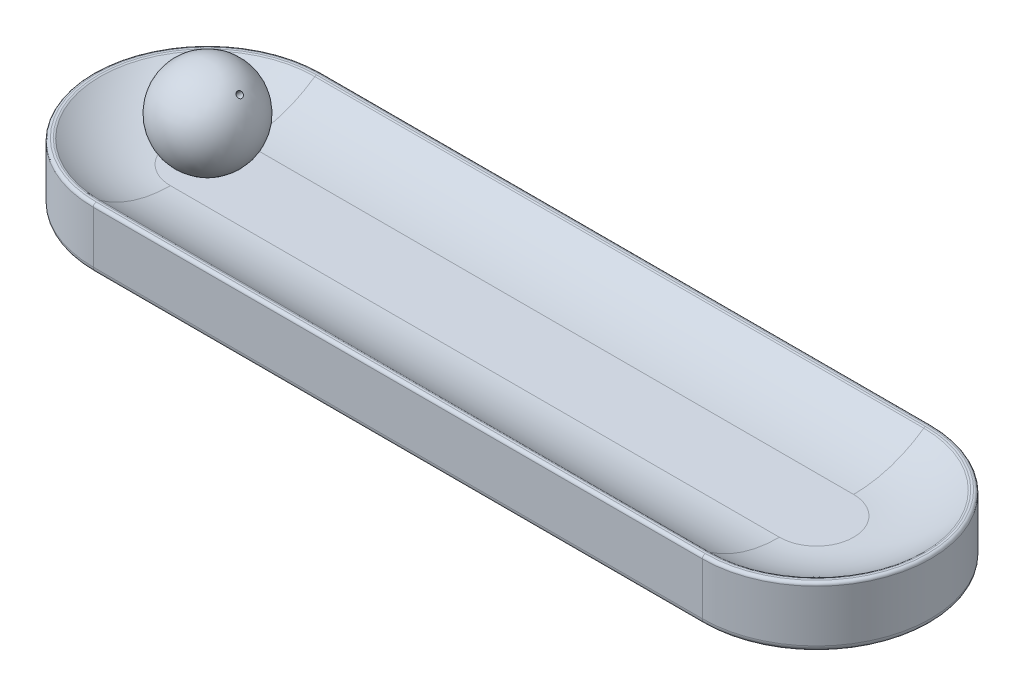
ISO-10303-21;
HEADER;
FILE_DESCRIPTION(('STEP AP214'),'2;1');
FILE_NAME('part.step','',(''),(''),'','','');
FILE_SCHEMA(('AUTOMOTIVE_DESIGN { 1 0 10303 214 1 1 1 1 }'));
ENDSEC;
DATA;
#1=APPLICATION_CONTEXT('core data for automotive mechanical design processes');
#2=APPLICATION_PROTOCOL_DEFINITION('international standard','automotive_design',2000,#1);
#3=PRODUCT_CONTEXT('',#1,'mechanical');
#4=PRODUCT('Part','Part','',(#3));
#5=PRODUCT_RELATED_PRODUCT_CATEGORY('part','',(#4));
#6=PRODUCT_DEFINITION_FORMATION('','',#4);
#7=PRODUCT_DEFINITION_CONTEXT('part definition',#1,'design');
#8=PRODUCT_DEFINITION('design','',#6,#7);
#9=PRODUCT_DEFINITION_SHAPE('','',#8);
#10=(LENGTH_UNIT() NAMED_UNIT(*) SI_UNIT(.MILLI.,.METRE.));
#11=(NAMED_UNIT(*) PLANE_ANGLE_UNIT() SI_UNIT($,.RADIAN.));
#12=(NAMED_UNIT(*) SI_UNIT($,.STERADIAN.) SOLID_ANGLE_UNIT());
#13=UNCERTAINTY_MEASURE_WITH_UNIT(LENGTH_MEASURE(1.E-05),#10,'distance_accuracy_value','');
#14=(GEOMETRIC_REPRESENTATION_CONTEXT(3) GLOBAL_UNCERTAINTY_ASSIGNED_CONTEXT((#13)) GLOBAL_UNIT_ASSIGNED_CONTEXT((#10,
#11,#12)) REPRESENTATION_CONTEXT('',''));
#15=CARTESIAN_POINT('',(0.,0.,0.));
#16=DIRECTION('',(0.,0.,1.));
#17=DIRECTION('',(1.,0.,0.));
#18=AXIS2_PLACEMENT_3D('',#15,#16,#17);
#19=CARTESIAN_POINT('',(-100.,20.,0.));
#20=DIRECTION('',(0.,-1.,0.));
#21=DIRECTION('',(0.,0.,-1.));
#22=AXIS2_PLACEMENT_3D('',#19,#20,#21);
#23=CYLINDRICAL_SURFACE('',#22,37.5);
#24=DIRECTION('',(0.,-1.,0.));
#25=VECTOR('',#24,1.);
#26=CARTESIAN_POINT('',(-100.,20.,-37.5));
#27=LINE('',#26,#25);
#28=CARTESIAN_POINT('',(-100.,19.,-37.5));
#29=VERTEX_POINT('',#28);
#30=CARTESIAN_POINT('',(-100.,2.,-37.5));
#31=VERTEX_POINT('',#30);
#32=EDGE_CURVE('E165',#29,#31,#27,.T.);
#33=ORIENTED_EDGE('',*,*,#32,.T.);
#34=CARTESIAN_POINT('',(-100.,2.,0.));
#35=DIRECTION('',(0.,1.,0.));
#36=DIRECTION('',(0.,0.,1.));
#37=AXIS2_PLACEMENT_3D('',#34,#35,#36);
#38=CIRCLE('',#37,37.5);
#39=CARTESIAN_POINT('',(-100.,2.,37.5));
#40=VERTEX_POINT('',#39);
#41=EDGE_CURVE('E11',#31,#40,#38,.T.);
#42=ORIENTED_EDGE('',*,*,#41,.T.);
#43=DIRECTION('',(0.,-1.,0.));
#44=VECTOR('',#43,1.);
#45=CARTESIAN_POINT('',(-100.,20.,37.5));
#46=LINE('',#45,#44);
#47=CARTESIAN_POINT('',(-100.,19.,37.5));
#48=VERTEX_POINT('',#47);
#49=EDGE_CURVE('E173',#48,#40,#46,.T.);
#50=ORIENTED_EDGE('',*,*,#49,.F.);
#51=CARTESIAN_POINT('',(-100.,19.,0.));
#52=DIRECTION('',(0.,1.,0.));
#53=DIRECTION('',(0.,0.,1.));
#54=AXIS2_PLACEMENT_3D('',#51,#52,#53);
#55=CIRCLE('',#54,37.5);
#56=EDGE_CURVE('E242',#48,#29,#55,.F.);
#57=ORIENTED_EDGE('',*,*,#56,.T.);
#58=EDGE_LOOP('',(#33,#42,#50,#57));
#59=FACE_BOUND('',#58,.T.);
#60=ADVANCED_FACE('F39',(#59),#23,.T.);
#61=CARTESIAN_POINT('',(-100.,20.,37.5));
#62=DIRECTION('',(0.,0.,-1.));
#63=DIRECTION('',(-1.,0.,0.));
#64=AXIS2_PLACEMENT_3D('',#61,#62,#63);
#65=PLANE('',#64);
#66=ORIENTED_EDGE('',*,*,#49,.T.);
#67=DIRECTION('',(1.,0.,0.));
#68=VECTOR('',#67,1.);
#69=CARTESIAN_POINT('',(-100.,2.,37.5));
#70=LINE('',#69,#68);
#71=CARTESIAN_POINT('',(100.,2.,37.5));
#72=VERTEX_POINT('',#71);
#73=EDGE_CURVE('E245',#40,#72,#70,.T.);
#74=ORIENTED_EDGE('',*,*,#73,.T.);
#75=DIRECTION('',(0.,-1.,0.));
#76=VECTOR('',#75,1.);
#77=CARTESIAN_POINT('',(100.,20.,37.5));
#78=LINE('',#77,#76);
#79=CARTESIAN_POINT('',(100.,19.,37.5));
#80=VERTEX_POINT('',#79);
#81=EDGE_CURVE('E177',#80,#72,#78,.T.);
#82=ORIENTED_EDGE('',*,*,#81,.F.);
#83=DIRECTION('',(1.,0.,0.));
#84=VECTOR('',#83,1.);
#85=CARTESIAN_POINT('',(-100.,19.,37.5));
#86=LINE('',#85,#84);
#87=EDGE_CURVE('E237',#80,#48,#86,.F.);
#88=ORIENTED_EDGE('',*,*,#87,.T.);
#89=EDGE_LOOP('',(#66,#74,#82,#88));
#90=FACE_BOUND('',#89,.T.);
#91=ADVANCED_FACE('F332',(#90),#65,.F.);
#92=CARTESIAN_POINT('',(100.,20.,0.));
#93=DIRECTION('',(0.,-1.,0.));
#94=DIRECTION('',(0.,0.,-1.));
#95=AXIS2_PLACEMENT_3D('',#92,#93,#94);
#96=CYLINDRICAL_SURFACE('',#95,37.5);
#97=ORIENTED_EDGE('',*,*,#81,.T.);
#98=CARTESIAN_POINT('',(100.,2.,0.));
#99=DIRECTION('',(0.,1.,0.));
#100=DIRECTION('',(0.,0.,1.));
#101=AXIS2_PLACEMENT_3D('',#98,#99,#100);
#102=CIRCLE('',#101,37.5);
#103=CARTESIAN_POINT('',(100.,2.,-37.5));
#104=VERTEX_POINT('',#103);
#105=EDGE_CURVE('E64',#72,#104,#102,.T.);
#106=ORIENTED_EDGE('',*,*,#105,.T.);
#107=DIRECTION('',(0.,-1.,0.));
#108=VECTOR('',#107,1.);
#109=CARTESIAN_POINT('',(100.,20.,-37.5));
#110=LINE('',#109,#108);
#111=CARTESIAN_POINT('',(100.,19.,-37.5));
#112=VERTEX_POINT('',#111);
#113=EDGE_CURVE('E324',#112,#104,#110,.T.);
#114=ORIENTED_EDGE('',*,*,#113,.F.);
#115=CARTESIAN_POINT('',(100.,19.,0.));
#116=DIRECTION('',(0.,1.,0.));
#117=DIRECTION('',(0.,0.,1.));
#118=AXIS2_PLACEMENT_3D('',#115,#116,#117);
#119=CIRCLE('',#118,37.5);
#120=EDGE_CURVE('E234',#112,#80,#119,.F.);
#121=ORIENTED_EDGE('',*,*,#120,.T.);
#122=EDGE_LOOP('',(#97,#106,#114,#121));
#123=FACE_BOUND('',#122,.T.);
#124=ADVANCED_FACE('F328',(#123),#96,.T.);
#125=CARTESIAN_POINT('',(-100.,20.,-37.5));
#126=DIRECTION('',(0.,0.,1.));
#127=DIRECTION('',(1.,0.,0.));
#128=AXIS2_PLACEMENT_3D('',#125,#126,#127);
#129=PLANE('',#128);
#130=ORIENTED_EDGE('',*,*,#113,.T.);
#131=DIRECTION('',(-1.,0.,0.));
#132=VECTOR('',#131,1.);
#133=CARTESIAN_POINT('',(-100.,2.,-37.5));
#134=LINE('',#133,#132);
#135=EDGE_CURVE('E49',#104,#31,#134,.T.);
#136=ORIENTED_EDGE('',*,*,#135,.T.);
#137=ORIENTED_EDGE('',*,*,#32,.F.);
#138=DIRECTION('',(-1.,0.,0.));
#139=VECTOR('',#138,1.);
#140=CARTESIAN_POINT('',(100.,19.,-37.5));
#141=LINE('',#140,#139);
#142=EDGE_CURVE('E230',#29,#112,#141,.F.);
#143=ORIENTED_EDGE('',*,*,#142,.T.);
#144=EDGE_LOOP('',(#130,#136,#137,#143));
#145=FACE_BOUND('',#144,.T.);
#146=ADVANCED_FACE('F355',(#145),#129,.F.);
#147=CARTESIAN_POINT('',(-100.,20.,0.));
#148=DIRECTION('',(0.,1.,0.));
#149=DIRECTION('',(0.,0.,1.));
#150=AXIS2_PLACEMENT_3D('',#147,#148,#149);
#151=PLANE('',#150);
#152=CARTESIAN_POINT('',(-100.,20.,0.));
#153=DIRECTION('',(0.,1.,0.));
#154=DIRECTION('',(0.,0.,1.));
#155=AXIS2_PLACEMENT_3D('',#152,#153,#154);
#156=CIRCLE('',#155,35.8194456744236);
#157=CARTESIAN_POINT('',(-100.,20.,35.8194456744236));
#158=VERTEX_POINT('',#157);
#159=CARTESIAN_POINT('',(-100.,20.,-35.8194456744236));
#160=VERTEX_POINT('',#159);
#161=EDGE_CURVE('E211',#158,#160,#156,.F.);
#162=ORIENTED_EDGE('',*,*,#161,.T.);
#163=DIRECTION('',(-1.,0.,0.));
#164=VECTOR('',#163,1.);
#165=CARTESIAN_POINT('',(100.,20.,-35.8194456744236));
#166=LINE('',#165,#164);
#167=CARTESIAN_POINT('',(100.,20.,-35.8194456744236));
#168=VERTEX_POINT('',#167);
#169=EDGE_CURVE('E220',#160,#168,#166,.F.);
#170=ORIENTED_EDGE('',*,*,#169,.T.);
#171=CARTESIAN_POINT('',(100.,20.,0.));
#172=DIRECTION('',(0.,1.,0.));
#173=DIRECTION('',(0.,0.,1.));
#174=AXIS2_PLACEMENT_3D('',#171,#172,#173);
#175=CIRCLE('',#174,35.8194456744236);
#176=CARTESIAN_POINT('',(100.,20.,35.8194456744236));
#177=VERTEX_POINT('',#176);
#178=EDGE_CURVE('E217',#168,#177,#175,.F.);
#179=ORIENTED_EDGE('',*,*,#178,.T.);
#180=DIRECTION('',(1.,0.,0.));
#181=VECTOR('',#180,1.);
#182=CARTESIAN_POINT('',(-100.,20.,35.8194456744236));
#183=LINE('',#182,#181);
#184=EDGE_CURVE('E214',#177,#158,#183,.F.);
#185=ORIENTED_EDGE('',*,*,#184,.T.);
#186=EDGE_LOOP('',(#162,#170,#179,#185));
#187=FACE_BOUND('',#186,.T.);
#188=CARTESIAN_POINT('',(100.,20.,0.));
#189=DIRECTION('',(0.,1.,0.));
#190=DIRECTION('',(0.,0.,1.));
#191=AXIS2_PLACEMENT_3D('',#188,#189,#190);
#192=CIRCLE('',#191,36.5);
#193=CARTESIAN_POINT('',(100.,20.,36.5));
#194=VERTEX_POINT('',#193);
#195=CARTESIAN_POINT('',(100.,20.,-36.5));
#196=VERTEX_POINT('',#195);
#197=EDGE_CURVE('E204',#194,#196,#192,.T.);
#198=ORIENTED_EDGE('',*,*,#197,.T.);
#199=DIRECTION('',(-1.,0.,0.));
#200=VECTOR('',#199,1.);
#201=CARTESIAN_POINT('',(-100.,20.,-36.5));
#202=LINE('',#201,#200);
#203=CARTESIAN_POINT('',(-100.,20.,-36.5));
#204=VERTEX_POINT('',#203);
#205=EDGE_CURVE('E207',#196,#204,#202,.T.);
#206=ORIENTED_EDGE('',*,*,#205,.T.);
#207=CARTESIAN_POINT('',(-100.,20.,0.));
#208=DIRECTION('',(0.,1.,0.));
#209=DIRECTION('',(0.,0.,1.));
#210=AXIS2_PLACEMENT_3D('',#207,#208,#209);
#211=CIRCLE('',#210,36.5);
#212=CARTESIAN_POINT('',(-100.,20.,36.5));
#213=VERTEX_POINT('',#212);
#214=EDGE_CURVE('E198',#204,#213,#211,.T.);
#215=ORIENTED_EDGE('',*,*,#214,.T.);
#216=DIRECTION('',(1.,0.,0.));
#217=VECTOR('',#216,1.);
#218=CARTESIAN_POINT('',(100.,20.,36.5));
#219=LINE('',#218,#217);
#220=EDGE_CURVE('E201',#213,#194,#219,.T.);
#221=ORIENTED_EDGE('',*,*,#220,.T.);
#222=EDGE_LOOP('',(#198,#206,#215,#221));
#223=FACE_BOUND('',#222,.T.);
#224=ADVANCED_FACE('F347',(#187,#223),#151,.T.);
#225=CARTESIAN_POINT('',(-100.,0.,0.));
#226=DIRECTION('',(0.,1.,0.));
#227=DIRECTION('',(0.,0.,1.));
#228=AXIS2_PLACEMENT_3D('',#225,#226,#227);
#229=PLANE('',#228);
#230=CARTESIAN_POINT('',(100.,0.,0.));
#231=DIRECTION('',(0.,1.,0.));
#232=DIRECTION('',(0.,0.,1.));
#233=AXIS2_PLACEMENT_3D('',#230,#231,#232);
#234=CIRCLE('',#233,35.5);
#235=CARTESIAN_POINT('',(100.,0.,-35.5));
#236=VERTEX_POINT('',#235);
#237=CARTESIAN_POINT('',(100.,0.,35.5));
#238=VERTEX_POINT('',#237);
#239=EDGE_CURVE('E283',#236,#238,#234,.F.);
#240=ORIENTED_EDGE('',*,*,#239,.T.);
#241=DIRECTION('',(1.,0.,0.));
#242=VECTOR('',#241,1.);
#243=CARTESIAN_POINT('',(-100.,0.,35.5));
#244=LINE('',#243,#242);
#245=CARTESIAN_POINT('',(-100.,0.,35.5));
#246=VERTEX_POINT('',#245);
#247=EDGE_CURVE('E286',#238,#246,#244,.F.);
#248=ORIENTED_EDGE('',*,*,#247,.T.);
#249=CARTESIAN_POINT('',(-100.,0.,0.));
#250=DIRECTION('',(0.,1.,0.));
#251=DIRECTION('',(0.,0.,1.));
#252=AXIS2_PLACEMENT_3D('',#249,#250,#251);
#253=CIRCLE('',#252,35.5);
#254=CARTESIAN_POINT('',(-100.,0.,-35.5));
#255=VERTEX_POINT('',#254);
#256=EDGE_CURVE('E277',#246,#255,#253,.F.);
#257=ORIENTED_EDGE('',*,*,#256,.T.);
#258=DIRECTION('',(-1.,0.,0.));
#259=VECTOR('',#258,1.);
#260=CARTESIAN_POINT('',(-100.,0.,-35.5));
#261=LINE('',#260,#259);
#262=EDGE_CURVE('E280',#255,#236,#261,.F.);
#263=ORIENTED_EDGE('',*,*,#262,.T.);
#264=EDGE_LOOP('',(#240,#248,#257,#263));
#265=FACE_BOUND('',#264,.T.);
#266=ADVANCED_FACE('F417',(#265),#229,.F.);
#267=CARTESIAN_POINT('',(-100.,12.5,0.));
#268=DIRECTION('',(0.,1.,0.));
#269=DIRECTION('',(0.,0.,1.));
#270=AXIS2_PLACEMENT_3D('',#267,#268,#269);
#271=PLANE('',#270);
#272=CARTESIAN_POINT('',(-100.,12.5,0.));
#273=DIRECTION('',(0.,1.,0.));
#274=DIRECTION('',(0.,0.,1.));
#275=AXIS2_PLACEMENT_3D('',#272,#273,#274);
#276=CIRCLE('',#275,3.84057287393431);
#277=CARTESIAN_POINT('',(-100.,12.5,3.84057287393431));
#278=VERTEX_POINT('',#277);
#279=EDGE_CURVE('E298',#278,#278,#276,.F.);
#280=ORIENTED_EDGE('',*,*,#279,.T.);
#281=EDGE_LOOP('',(#280));
#282=FACE_BOUND('',#281,.T.);
#283=DIRECTION('',(1.,0.,0.));
#284=VECTOR('',#283,1.);
#285=CARTESIAN_POINT('',(100.,12.5,12.181552367278));
#286=LINE('',#285,#284);
#287=CARTESIAN_POINT('',(-100.,12.5,12.181552367278));
#288=VERTEX_POINT('',#287);
#289=CARTESIAN_POINT('',(100.,12.5,12.181552367278));
#290=VERTEX_POINT('',#289);
#291=EDGE_CURVE('E149',#288,#290,#286,.T.);
#292=ORIENTED_EDGE('',*,*,#291,.T.);
#293=CARTESIAN_POINT('',(100.,12.5,0.));
#294=DIRECTION('',(0.,1.,0.));
#295=DIRECTION('',(0.,0.,1.));
#296=AXIS2_PLACEMENT_3D('',#293,#294,#295);
#297=CIRCLE('',#296,12.181552367278);
#298=CARTESIAN_POINT('',(100.,12.5,-12.181552367278));
#299=VERTEX_POINT('',#298);
#300=EDGE_CURVE('E183',#290,#299,#297,.T.);
#301=ORIENTED_EDGE('',*,*,#300,.T.);
#302=DIRECTION('',(-1.,0.,0.));
#303=VECTOR('',#302,1.);
#304=CARTESIAN_POINT('',(-100.,12.5,-12.181552367278));
#305=LINE('',#304,#303);
#306=CARTESIAN_POINT('',(-100.,12.5,-12.181552367278));
#307=VERTEX_POINT('',#306);
#308=EDGE_CURVE('E152',#299,#307,#305,.T.);
#309=ORIENTED_EDGE('',*,*,#308,.T.);
#310=CARTESIAN_POINT('',(-100.,12.5,0.));
#311=DIRECTION('',(0.,1.,0.));
#312=DIRECTION('',(0.,0.,1.));
#313=AXIS2_PLACEMENT_3D('',#310,#311,#312);
#314=CIRCLE('',#313,12.181552367278);
#315=EDGE_CURVE('E144',#307,#288,#314,.T.);
#316=ORIENTED_EDGE('',*,*,#315,.T.);
#317=EDGE_LOOP('',(#292,#301,#309,#316));
#318=FACE_BOUND('',#317,.T.);
#319=ADVANCED_FACE('F146',(#282,#318),#271,.T.);
#320=CARTESIAN_POINT('',(-100.,52.5,0.));
#321=DIRECTION('',(0.,-1.,0.));
#322=DIRECTION('',(0.,0.,-1.));
#323=AXIS2_PLACEMENT_3D('',#320,#321,#322);
#324=DEGENERATE_TOROIDAL_SURFACE('',#323,12.181552367278,40.,.T.);
#325=CARTESIAN_POINT('',(-100.,52.5,-12.181552367278));
#326=DIRECTION('',(-1.,0.,0.));
#327=DIRECTION('',(0.,0.,1.));
#328=AXIS2_PLACEMENT_3D('',#325,#326,#327);
#329=CIRCLE('',#328,40.);
#330=CARTESIAN_POINT('',(-100.,19.8170731707317,-35.2429116913225));
#331=VERTEX_POINT('',#330);
#332=EDGE_CURVE('E166',#331,#307,#329,.T.);
#333=ORIENTED_EDGE('',*,*,#332,.F.);
#334=CARTESIAN_POINT('',(-100.,19.8170731707317,0.));
#335=DIRECTION('',(0.,1.,0.));
#336=DIRECTION('',(0.,0.,1.));
#337=AXIS2_PLACEMENT_3D('',#334,#335,#336);
#338=CIRCLE('',#337,35.2429116913225);
#339=CARTESIAN_POINT('',(-100.,19.8170731707317,35.2429116913225));
#340=VERTEX_POINT('',#339);
#341=EDGE_CURVE('E161',#331,#340,#338,.T.);
#342=ORIENTED_EDGE('',*,*,#341,.T.);
#343=CARTESIAN_POINT('',(-100.,52.5,12.181552367278));
#344=DIRECTION('',(-1.,0.,0.));
#345=DIRECTION('',(0.,0.,1.));
#346=AXIS2_PLACEMENT_3D('',#343,#344,#345);
#347=CIRCLE('',#346,40.);
#348=EDGE_CURVE('E158',#288,#340,#347,.T.);
#349=ORIENTED_EDGE('',*,*,#348,.F.);
#350=ORIENTED_EDGE('',*,*,#315,.F.);
#351=EDGE_LOOP('',(#333,#342,#349,#350));
#352=FACE_BOUND('',#351,.T.);
#353=ADVANCED_FACE('F159',(#352),#324,.F.);
#354=CARTESIAN_POINT('',(-100.,52.5,12.181552367278));
#355=DIRECTION('',(-1.,0.,0.));
#356=DIRECTION('',(0.,0.,1.));
#357=AXIS2_PLACEMENT_3D('',#354,#355,#356);
#358=CYLINDRICAL_SURFACE('',#357,40.);
#359=ORIENTED_EDGE('',*,*,#348,.T.);
#360=DIRECTION('',(-1.,0.,0.));
#361=VECTOR('',#360,1.);
#362=CARTESIAN_POINT('',(-100.,19.8170731707317,35.2429116913225));
#363=LINE('',#362,#361);
#364=CARTESIAN_POINT('',(100.,19.8170731707317,35.2429116913225));
#365=VERTEX_POINT('',#364);
#366=EDGE_CURVE('E227',#340,#365,#363,.F.);
#367=ORIENTED_EDGE('',*,*,#366,.T.);
#368=CARTESIAN_POINT('',(100.,52.5,12.181552367278));
#369=DIRECTION('',(-1.,0.,0.));
#370=DIRECTION('',(0.,0.,1.));
#371=AXIS2_PLACEMENT_3D('',#368,#369,#370);
#372=CIRCLE('',#371,40.);
#373=EDGE_CURVE('E170',#290,#365,#372,.T.);
#374=ORIENTED_EDGE('',*,*,#373,.F.);
#375=ORIENTED_EDGE('',*,*,#291,.F.);
#376=EDGE_LOOP('',(#359,#367,#374,#375));
#377=FACE_BOUND('',#376,.T.);
#378=ADVANCED_FACE('F168',(#377),#358,.F.);
#379=CARTESIAN_POINT('',(100.,52.5,-12.181552367278));
#380=DIRECTION('',(1.,0.,0.));
#381=DIRECTION('',(0.,0.,-1.));
#382=AXIS2_PLACEMENT_3D('',#379,#380,#381);
#383=CYLINDRICAL_SURFACE('',#382,40.);
#384=CARTESIAN_POINT('',(100.,52.5,-12.181552367278));
#385=DIRECTION('',(-1.,0.,0.));
#386=DIRECTION('',(0.,0.,1.));
#387=AXIS2_PLACEMENT_3D('',#384,#385,#386);
#388=CIRCLE('',#387,40.);
#389=CARTESIAN_POINT('',(100.,19.8170731707317,-35.2429116913225));
#390=VERTEX_POINT('',#389);
#391=EDGE_CURVE('E187',#390,#299,#388,.T.);
#392=ORIENTED_EDGE('',*,*,#391,.F.);
#393=DIRECTION('',(1.,0.,0.));
#394=VECTOR('',#393,1.);
#395=CARTESIAN_POINT('',(100.,19.8170731707317,-35.2429116913225));
#396=LINE('',#395,#394);
#397=EDGE_CURVE('E186',#390,#331,#396,.F.);
#398=ORIENTED_EDGE('',*,*,#397,.T.);
#399=ORIENTED_EDGE('',*,*,#332,.T.);
#400=ORIENTED_EDGE('',*,*,#308,.F.);
#401=EDGE_LOOP('',(#392,#398,#399,#400));
#402=FACE_BOUND('',#401,.T.);
#403=ADVANCED_FACE('F380',(#402),#383,.F.);
#404=CARTESIAN_POINT('',(100.,52.5,0.));
#405=DIRECTION('',(0.,-1.,0.));
#406=DIRECTION('',(0.,0.,-1.));
#407=AXIS2_PLACEMENT_3D('',#404,#405,#406);
#408=DEGENERATE_TOROIDAL_SURFACE('',#407,12.181552367278,40.,.T.);
#409=ORIENTED_EDGE('',*,*,#373,.T.);
#410=CARTESIAN_POINT('',(100.,19.8170731707317,0.));
#411=DIRECTION('',(0.,1.,0.));
#412=DIRECTION('',(0.,0.,1.));
#413=AXIS2_PLACEMENT_3D('',#410,#411,#412);
#414=CIRCLE('',#413,35.2429116913225);
#415=EDGE_CURVE('E224',#365,#390,#414,.T.);
#416=ORIENTED_EDGE('',*,*,#415,.T.);
#417=ORIENTED_EDGE('',*,*,#391,.T.);
#418=ORIENTED_EDGE('',*,*,#300,.F.);
#419=EDGE_LOOP('',(#409,#416,#417,#418));
#420=FACE_BOUND('',#419,.T.);
#421=ADVANCED_FACE('F376',(#420),#408,.F.);
#422=CARTESIAN_POINT('',(-100.,19.,35.8194456744236));
#423=DIRECTION('',(-1.,0.,0.));
#424=DIRECTION('',(0.,0.,1.));
#425=AXIS2_PLACEMENT_3D('',#422,#423,#424);
#426=CYLINDRICAL_SURFACE('',#425,1.);
#427=CARTESIAN_POINT('',(-100.,19.,35.8194456744236));
#428=DIRECTION('',(-1.,0.,0.));
#429=DIRECTION('',(0.,0.,1.));
#430=AXIS2_PLACEMENT_3D('',#427,#428,#429);
#431=CIRCLE('',#430,1.);
#432=EDGE_CURVE('E253',#158,#340,#431,.T.);
#433=ORIENTED_EDGE('',*,*,#432,.F.);
#434=ORIENTED_EDGE('',*,*,#184,.F.);
#435=CARTESIAN_POINT('',(100.,19.,35.8194456744236));
#436=DIRECTION('',(1.,0.,0.));
#437=DIRECTION('',(0.,0.,-1.));
#438=AXIS2_PLACEMENT_3D('',#435,#436,#437);
#439=CIRCLE('',#438,1.);
#440=EDGE_CURVE('E190',#365,#177,#439,.T.);
#441=ORIENTED_EDGE('',*,*,#440,.F.);
#442=ORIENTED_EDGE('',*,*,#366,.F.);
#443=EDGE_LOOP('',(#433,#434,#441,#442));
#444=FACE_BOUND('',#443,.T.);
#445=ADVANCED_FACE('F379',(#444),#426,.T.);
#446=CARTESIAN_POINT('',(100.,19.,0.));
#447=DIRECTION('',(0.,1.,0.));
#448=DIRECTION('',(0.,0.,1.));
#449=AXIS2_PLACEMENT_3D('',#446,#447,#448);
#450=TOROIDAL_SURFACE('',#449,35.8194456744236,1.);
#451=ORIENTED_EDGE('',*,*,#440,.T.);
#452=ORIENTED_EDGE('',*,*,#178,.F.);
#453=CARTESIAN_POINT('',(100.,19.,-35.8194456744236));
#454=DIRECTION('',(-1.,0.,0.));
#455=DIRECTION('',(0.,0.,1.));
#456=AXIS2_PLACEMENT_3D('',#453,#454,#455);
#457=CIRCLE('',#456,1.);
#458=EDGE_CURVE('E249',#390,#168,#457,.T.);
#459=ORIENTED_EDGE('',*,*,#458,.F.);
#460=ORIENTED_EDGE('',*,*,#415,.F.);
#461=EDGE_LOOP('',(#451,#452,#459,#460));
#462=FACE_BOUND('',#461,.T.);
#463=ADVANCED_FACE('F396',(#462),#450,.T.);
#464=CARTESIAN_POINT('',(-100.,19.,0.));
#465=DIRECTION('',(0.,1.,0.));
#466=DIRECTION('',(0.,0.,1.));
#467=AXIS2_PLACEMENT_3D('',#464,#465,#466);
#468=TOROIDAL_SURFACE('',#467,35.8194456744236,1.);
#469=ORIENTED_EDGE('',*,*,#432,.T.);
#470=ORIENTED_EDGE('',*,*,#341,.F.);
#471=CARTESIAN_POINT('',(-100.,19.,-35.8194456744236));
#472=DIRECTION('',(1.,0.,0.));
#473=DIRECTION('',(0.,0.,-1.));
#474=AXIS2_PLACEMENT_3D('',#471,#472,#473);
#475=CIRCLE('',#474,1.);
#476=EDGE_CURVE('E246',#160,#331,#475,.T.);
#477=ORIENTED_EDGE('',*,*,#476,.F.);
#478=ORIENTED_EDGE('',*,*,#161,.F.);
#479=EDGE_LOOP('',(#469,#470,#477,#478));
#480=FACE_BOUND('',#479,.T.);
#481=ADVANCED_FACE('F392',(#480),#468,.T.);
#482=CARTESIAN_POINT('',(100.,19.,-35.8194456744236));
#483=DIRECTION('',(1.,0.,0.));
#484=DIRECTION('',(0.,0.,-1.));
#485=AXIS2_PLACEMENT_3D('',#482,#483,#484);
#486=CYLINDRICAL_SURFACE('',#485,1.);
#487=ORIENTED_EDGE('',*,*,#458,.T.);
#488=ORIENTED_EDGE('',*,*,#169,.F.);
#489=ORIENTED_EDGE('',*,*,#476,.T.);
#490=ORIENTED_EDGE('',*,*,#397,.F.);
#491=EDGE_LOOP('',(#487,#488,#489,#490));
#492=FACE_BOUND('',#491,.T.);
#493=ADVANCED_FACE('F389',(#492),#486,.T.);
#494=CARTESIAN_POINT('',(-100.,19.,36.5));
#495=DIRECTION('',(-1.,0.,0.));
#496=DIRECTION('',(0.,0.,1.));
#497=AXIS2_PLACEMENT_3D('',#494,#495,#496);
#498=CYLINDRICAL_SURFACE('',#497,1.);
#499=CARTESIAN_POINT('',(-100.,19.,36.5));
#500=DIRECTION('',(-1.,0.,0.));
#501=DIRECTION('',(0.,0.,1.));
#502=AXIS2_PLACEMENT_3D('',#499,#500,#501);
#503=CIRCLE('',#502,1.);
#504=EDGE_CURVE('E267',#48,#213,#503,.T.);
#505=ORIENTED_EDGE('',*,*,#504,.F.);
#506=ORIENTED_EDGE('',*,*,#87,.F.);
#507=CARTESIAN_POINT('',(100.,19.,36.5));
#508=DIRECTION('',(1.,0.,0.));
#509=DIRECTION('',(0.,0.,-1.));
#510=AXIS2_PLACEMENT_3D('',#507,#508,#509);
#511=CIRCLE('',#510,1.);
#512=EDGE_CURVE('E250',#194,#80,#511,.T.);
#513=ORIENTED_EDGE('',*,*,#512,.F.);
#514=ORIENTED_EDGE('',*,*,#220,.F.);
#515=EDGE_LOOP('',(#505,#506,#513,#514));
#516=FACE_BOUND('',#515,.T.);
#517=ADVANCED_FACE('F338',(#516),#498,.T.);
#518=CARTESIAN_POINT('',(100.,19.,0.));
#519=DIRECTION('',(0.,1.,0.));
#520=DIRECTION('',(0.,0.,1.));
#521=AXIS2_PLACEMENT_3D('',#518,#519,#520);
#522=TOROIDAL_SURFACE('',#521,36.5,1.);
#523=ORIENTED_EDGE('',*,*,#512,.T.);
#524=ORIENTED_EDGE('',*,*,#120,.F.);
#525=CARTESIAN_POINT('',(100.,19.,-36.5));
#526=DIRECTION('',(-1.,0.,0.));
#527=DIRECTION('',(0.,0.,1.));
#528=AXIS2_PLACEMENT_3D('',#525,#526,#527);
#529=CIRCLE('',#528,1.);
#530=EDGE_CURVE('E263',#196,#112,#529,.T.);
#531=ORIENTED_EDGE('',*,*,#530,.F.);
#532=ORIENTED_EDGE('',*,*,#197,.F.);
#533=EDGE_LOOP('',(#523,#524,#531,#532));
#534=FACE_BOUND('',#533,.T.);
#535=ADVANCED_FACE('F343',(#534),#522,.T.);
#536=CARTESIAN_POINT('',(-100.,19.,0.));
#537=DIRECTION('',(0.,1.,0.));
#538=DIRECTION('',(0.,0.,1.));
#539=AXIS2_PLACEMENT_3D('',#536,#537,#538);
#540=TOROIDAL_SURFACE('',#539,36.5,1.);
#541=ORIENTED_EDGE('',*,*,#504,.T.);
#542=ORIENTED_EDGE('',*,*,#214,.F.);
#543=CARTESIAN_POINT('',(-100.,19.,-36.5));
#544=DIRECTION('',(1.,0.,0.));
#545=DIRECTION('',(0.,0.,-1.));
#546=AXIS2_PLACEMENT_3D('',#543,#544,#545);
#547=CIRCLE('',#546,1.);
#548=EDGE_CURVE('E260',#29,#204,#547,.T.);
#549=ORIENTED_EDGE('',*,*,#548,.F.);
#550=ORIENTED_EDGE('',*,*,#56,.F.);
#551=EDGE_LOOP('',(#541,#542,#549,#550));
#552=FACE_BOUND('',#551,.T.);
#553=ADVANCED_FACE('F350',(#552),#540,.T.);
#554=CARTESIAN_POINT('',(-100.,19.,-36.5));
#555=DIRECTION('',(1.,0.,0.));
#556=DIRECTION('',(0.,0.,-1.));
#557=AXIS2_PLACEMENT_3D('',#554,#555,#556);
#558=CYLINDRICAL_SURFACE('',#557,1.);
#559=ORIENTED_EDGE('',*,*,#530,.T.);
#560=ORIENTED_EDGE('',*,*,#142,.F.);
#561=ORIENTED_EDGE('',*,*,#548,.T.);
#562=ORIENTED_EDGE('',*,*,#205,.F.);
#563=EDGE_LOOP('',(#559,#560,#561,#562));
#564=FACE_BOUND('',#563,.T.);
#565=ADVANCED_FACE('F357',(#564),#558,.T.);
#566=CARTESIAN_POINT('',(-100.,2.,-35.5));
#567=DIRECTION('',(-1.,0.,0.));
#568=DIRECTION('',(0.,0.,1.));
#569=AXIS2_PLACEMENT_3D('',#566,#567,#568);
#570=CYLINDRICAL_SURFACE('',#569,2.);
#571=CARTESIAN_POINT('',(100.,2.,-35.5));
#572=DIRECTION('',(1.,0.,0.));
#573=DIRECTION('',(0.,0.,-1.));
#574=AXIS2_PLACEMENT_3D('',#571,#572,#573);
#575=CIRCLE('',#574,2.);
#576=EDGE_CURVE('E301',#236,#104,#575,.T.);
#577=ORIENTED_EDGE('',*,*,#576,.F.);
#578=ORIENTED_EDGE('',*,*,#262,.F.);
#579=CARTESIAN_POINT('',(-100.,2.,-35.5));
#580=DIRECTION('',(-1.,0.,0.));
#581=DIRECTION('',(0.,0.,1.));
#582=AXIS2_PLACEMENT_3D('',#579,#580,#581);
#583=CIRCLE('',#582,2.);
#584=EDGE_CURVE('E264',#31,#255,#583,.T.);
#585=ORIENTED_EDGE('',*,*,#584,.F.);
#586=ORIENTED_EDGE('',*,*,#135,.F.);
#587=EDGE_LOOP('',(#577,#578,#585,#586));
#588=FACE_BOUND('',#587,.T.);
#589=ADVANCED_FACE('F41',(#588),#570,.T.);
#590=CARTESIAN_POINT('',(-100.,2.,0.));
#591=DIRECTION('',(0.,1.,0.));
#592=DIRECTION('',(0.,0.,1.));
#593=AXIS2_PLACEMENT_3D('',#590,#591,#592);
#594=TOROIDAL_SURFACE('',#593,35.5,2.);
#595=ORIENTED_EDGE('',*,*,#584,.T.);
#596=ORIENTED_EDGE('',*,*,#256,.F.);
#597=CARTESIAN_POINT('',(-100.,2.,35.5));
#598=DIRECTION('',(1.,0.,0.));
#599=DIRECTION('',(0.,0.,-1.));
#600=AXIS2_PLACEMENT_3D('',#597,#598,#599);
#601=CIRCLE('',#600,2.);
#602=EDGE_CURVE('E297',#40,#246,#601,.T.);
#603=ORIENTED_EDGE('',*,*,#602,.F.);
#604=ORIENTED_EDGE('',*,*,#41,.F.);
#605=EDGE_LOOP('',(#595,#596,#603,#604));
#606=FACE_BOUND('',#605,.T.);
#607=ADVANCED_FACE('F364',(#606),#594,.T.);
#608=CARTESIAN_POINT('',(100.,2.,0.));
#609=DIRECTION('',(0.,1.,0.));
#610=DIRECTION('',(0.,0.,1.));
#611=AXIS2_PLACEMENT_3D('',#608,#609,#610);
#612=TOROIDAL_SURFACE('',#611,35.5,2.);
#613=ORIENTED_EDGE('',*,*,#576,.T.);
#614=ORIENTED_EDGE('',*,*,#105,.F.);
#615=CARTESIAN_POINT('',(100.,2.,35.5));
#616=DIRECTION('',(-1.,0.,0.));
#617=DIRECTION('',(0.,0.,1.));
#618=AXIS2_PLACEMENT_3D('',#615,#616,#617);
#619=CIRCLE('',#618,2.);
#620=EDGE_CURVE('E294',#238,#72,#619,.T.);
#621=ORIENTED_EDGE('',*,*,#620,.F.);
#622=ORIENTED_EDGE('',*,*,#239,.F.);
#623=EDGE_LOOP('',(#613,#614,#621,#622));
#624=FACE_BOUND('',#623,.T.);
#625=ADVANCED_FACE('F462',(#624),#612,.T.);
#626=CARTESIAN_POINT('',(-100.,2.,35.5));
#627=DIRECTION('',(1.,0.,0.));
#628=DIRECTION('',(0.,0.,-1.));
#629=AXIS2_PLACEMENT_3D('',#626,#627,#628);
#630=CYLINDRICAL_SURFACE('',#629,2.);
#631=ORIENTED_EDGE('',*,*,#602,.T.);
#632=ORIENTED_EDGE('',*,*,#247,.F.);
#633=ORIENTED_EDGE('',*,*,#620,.T.);
#634=ORIENTED_EDGE('',*,*,#73,.F.);
#635=EDGE_LOOP('',(#631,#632,#633,#634));
#636=FACE_BOUND('',#635,.T.);
#637=ADVANCED_FACE('F471',(#636),#630,.T.);
#638=CARTESIAN_POINT('',(-100.,27.,0.));
#639=DIRECTION('',(0.,-1.,0.));
#640=DIRECTION('',(-1.,0.,0.));
#641=AXIS2_PLACEMENT_3D('',#638,#639,#640);
#642=SPHERICAL_SURFACE('',#641,15.);
#643=CARTESIAN_POINT('',(-89.4169947557416,37.5830052442583,0.));
#644=DIRECTION('',(-0.707106781186546,-0.707106781186549,0.));
#645=DIRECTION('',(0.707106781186549,-0.707106781186546,0.));
#646=AXIS2_PLACEMENT_3D('',#643,#644,#645);
#647=CIRCLE('',#646,0.999999999999995);
#648=CARTESIAN_POINT('',(-88.7098879745551,36.8758984630718,0.));
#649=VERTEX_POINT('',#648);
#650=EDGE_CURVE('E43',#649,#649,#647,.T.);
#651=ORIENTED_EDGE('',*,*,#650,.T.);
#652=EDGE_LOOP('',(#651));
#653=FACE_BOUND('',#652,.T.);
#654=ORIENTED_EDGE('',*,*,#279,.F.);
#655=EDGE_LOOP('',(#654));
#656=FACE_BOUND('',#655,.T.);
#657=ADVANCED_FACE('F481',(#653,#656),#642,.T.);
#658=CARTESIAN_POINT('',(-100.,27.,0.));
#659=DIRECTION('',(0.707106781186546,0.707106781186549,0.));
#660=DIRECTION('',(-0.707106781186549,0.707106781186546,0.));
#661=AXIS2_PLACEMENT_3D('',#658,#659,#660);
#662=CYLINDRICAL_SURFACE('',#661,0.999999999999995);
#663=CARTESIAN_POINT('',(-100.,27.,0.));
#664=DIRECTION('',(0.707106781186546,0.707106781186549,0.));
#665=DIRECTION('',(-0.707106781186549,0.707106781186546,0.));
#666=AXIS2_PLACEMENT_3D('',#663,#664,#665);
#667=CIRCLE('',#666,0.999999999999995);
#668=CARTESIAN_POINT('',(-100.707106781187,27.7071067811865,0.));
#669=VERTEX_POINT('',#668);
#670=EDGE_CURVE('E313',#669,#669,#667,.T.);
#671=ORIENTED_EDGE('',*,*,#670,.F.);
#672=EDGE_LOOP('',(#671));
#673=FACE_BOUND('',#672,.T.);
#674=ORIENTED_EDGE('',*,*,#650,.F.);
#675=EDGE_LOOP('',(#674));
#676=FACE_BOUND('',#675,.T.);
#677=ADVANCED_FACE('F497',(#673,#676),#662,.F.);
#678=CARTESIAN_POINT('',(-100.,27.,0.));
#679=DIRECTION('',(0.707106781186546,0.707106781186549,0.));
#680=DIRECTION('',(-0.707106781186549,0.707106781186546,0.));
#681=AXIS2_PLACEMENT_3D('',#678,#679,#680);
#682=PLANE('',#681);
#683=ORIENTED_EDGE('',*,*,#670,.T.);
#684=EDGE_LOOP('',(#683));
#685=FACE_BOUND('',#684,.T.);
#686=ADVANCED_FACE('F505',(#685),#682,.T.);
#687=CLOSED_SHELL('',(#60,#91,#124,#146,#224,#266,#319,#353,#378,#403,#421,#445,#463,#481,#493,
#517,#535,#553,#565,#589,#607,#625,#637,#657,#677,#686));
#688=MANIFOLD_SOLID_BREP('B2',#687);
#689=ADVANCED_BREP_SHAPE_REPRESENTATION('',(#18,#688),#14);
#690=SHAPE_DEFINITION_REPRESENTATION(#9,#689);
ENDSEC;
END-ISO-10303-21;
